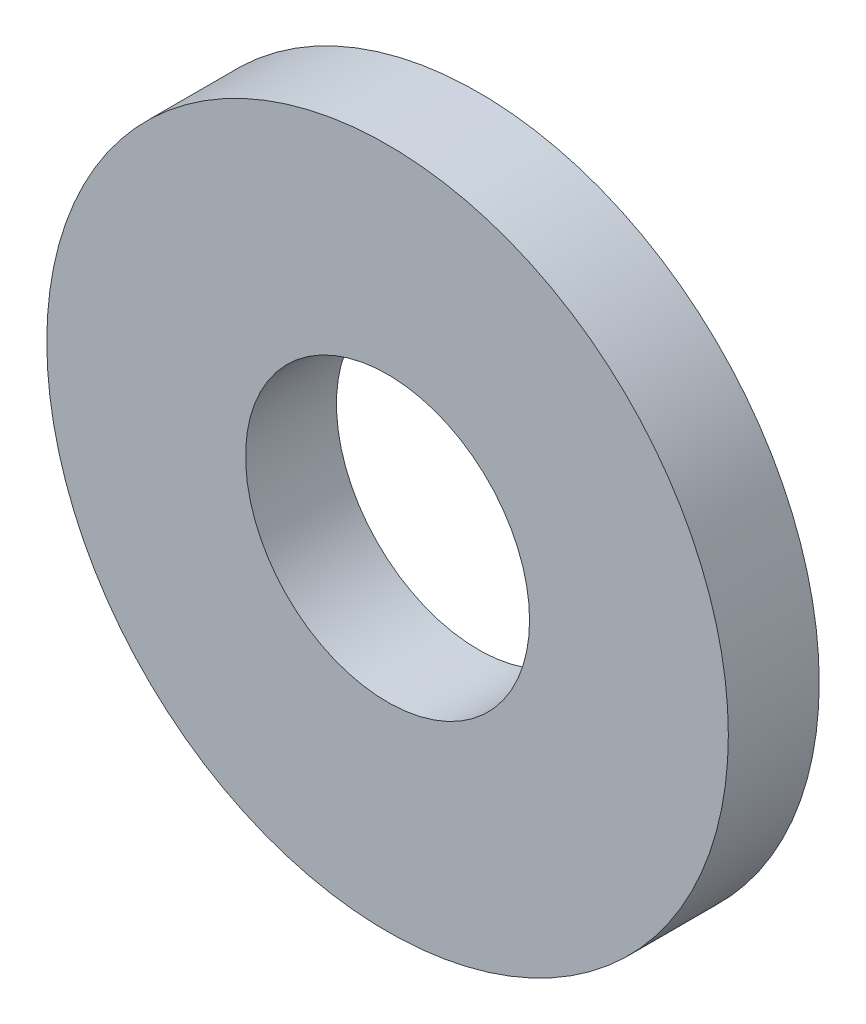
ISO-10303-21;
HEADER;
FILE_DESCRIPTION(('STEP AP214'),'2;1');
FILE_NAME('part.step','',(''),(''),'','','');
FILE_SCHEMA(('AUTOMOTIVE_DESIGN { 1 0 10303 214 1 1 1 1 }'));
ENDSEC;
DATA;
#1=APPLICATION_CONTEXT('core data for automotive mechanical design processes');
#2=APPLICATION_PROTOCOL_DEFINITION('international standard','automotive_design',2000,#1);
#3=PRODUCT_CONTEXT('',#1,'mechanical');
#4=PRODUCT('Part','Part','',(#3));
#5=PRODUCT_RELATED_PRODUCT_CATEGORY('part','',(#4));
#6=PRODUCT_DEFINITION_FORMATION('','',#4);
#7=PRODUCT_DEFINITION_CONTEXT('part definition',#1,'design');
#8=PRODUCT_DEFINITION('design','',#6,#7);
#9=PRODUCT_DEFINITION_SHAPE('','',#8);
#10=(LENGTH_UNIT() NAMED_UNIT(*) SI_UNIT(.MILLI.,.METRE.));
#11=(NAMED_UNIT(*) PLANE_ANGLE_UNIT() SI_UNIT($,.RADIAN.));
#12=(NAMED_UNIT(*) SI_UNIT($,.STERADIAN.) SOLID_ANGLE_UNIT());
#13=UNCERTAINTY_MEASURE_WITH_UNIT(LENGTH_MEASURE(1.E-05),#10,'distance_accuracy_value','');
#14=(GEOMETRIC_REPRESENTATION_CONTEXT(3) GLOBAL_UNCERTAINTY_ASSIGNED_CONTEXT((#13)) GLOBAL_UNIT_ASSIGNED_CONTEXT((#10,
#11,#12)) REPRESENTATION_CONTEXT('',''));
#15=CARTESIAN_POINT('',(0.,0.,0.));
#16=DIRECTION('',(0.,0.,1.));
#17=DIRECTION('',(1.,0.,0.));
#18=AXIS2_PLACEMENT_3D('',#15,#16,#17);
#19=CARTESIAN_POINT('',(0.,0.,1.27));
#20=DIRECTION('',(0.,0.,1.));
#21=DIRECTION('',(1.,0.,0.));
#22=AXIS2_PLACEMENT_3D('',#19,#20,#21);
#23=PLANE('',#22);
#24=CARTESIAN_POINT('',(0.,0.,1.27));
#25=DIRECTION('',(0.,0.,1.));
#26=DIRECTION('',(1.,0.,0.));
#27=AXIS2_PLACEMENT_3D('',#24,#25,#26);
#28=CIRCLE('',#27,4.7625);
#29=CARTESIAN_POINT('',(4.7625,0.,1.27));
#30=VERTEX_POINT('',#29);
#31=EDGE_CURVE('E10',#30,#30,#28,.T.);
#32=ORIENTED_EDGE('',*,*,#31,.T.);
#33=EDGE_LOOP('',(#32));
#34=FACE_BOUND('',#33,.T.);
#35=CARTESIAN_POINT('',(0.,0.,1.27));
#36=DIRECTION('',(0.,0.,1.));
#37=DIRECTION('',(1.,0.,0.));
#38=AXIS2_PLACEMENT_3D('',#35,#36,#37);
#39=CIRCLE('',#38,1.984375);
#40=CARTESIAN_POINT('',(1.984375,0.,1.27));
#41=VERTEX_POINT('',#40);
#42=EDGE_CURVE('E41',#41,#41,#39,.T.);
#43=ORIENTED_EDGE('',*,*,#42,.F.);
#44=EDGE_LOOP('',(#43));
#45=FACE_BOUND('',#44,.T.);
#46=ADVANCED_FACE('F30',(#34,#45),#23,.T.);
#47=CARTESIAN_POINT('',(0.,0.,0.));
#48=DIRECTION('',(0.,0.,1.));
#49=DIRECTION('',(1.,0.,0.));
#50=AXIS2_PLACEMENT_3D('',#47,#48,#49);
#51=PLANE('',#50);
#52=CARTESIAN_POINT('',(0.,0.,0.));
#53=DIRECTION('',(0.,0.,1.));
#54=DIRECTION('',(1.,0.,0.));
#55=AXIS2_PLACEMENT_3D('',#52,#53,#54);
#56=CIRCLE('',#55,4.7625);
#57=CARTESIAN_POINT('',(4.7625,0.,0.));
#58=VERTEX_POINT('',#57);
#59=EDGE_CURVE('E34',#58,#58,#56,.T.);
#60=ORIENTED_EDGE('',*,*,#59,.F.);
#61=EDGE_LOOP('',(#60));
#62=FACE_BOUND('',#61,.T.);
#63=CARTESIAN_POINT('',(0.,0.,0.));
#64=DIRECTION('',(0.,0.,1.));
#65=DIRECTION('',(1.,0.,0.));
#66=AXIS2_PLACEMENT_3D('',#63,#64,#65);
#67=CIRCLE('',#66,1.984375);
#68=CARTESIAN_POINT('',(1.984375,0.,0.));
#69=VERTEX_POINT('',#68);
#70=EDGE_CURVE('E43',#69,#69,#67,.T.);
#71=ORIENTED_EDGE('',*,*,#70,.T.);
#72=EDGE_LOOP('',(#71));
#73=FACE_BOUND('',#72,.T.);
#74=ADVANCED_FACE('F53',(#62,#73),#51,.F.);
#75=CARTESIAN_POINT('',(0.,0.,1.27));
#76=DIRECTION('',(0.,0.,-1.));
#77=DIRECTION('',(-1.,0.,0.));
#78=AXIS2_PLACEMENT_3D('',#75,#76,#77);
#79=CYLINDRICAL_SURFACE('',#78,4.7625);
#80=ORIENTED_EDGE('',*,*,#31,.F.);
#81=EDGE_LOOP('',(#80));
#82=FACE_BOUND('',#81,.T.);
#83=ORIENTED_EDGE('',*,*,#59,.T.);
#84=EDGE_LOOP('',(#83));
#85=FACE_BOUND('',#84,.T.);
#86=ADVANCED_FACE('F32',(#82,#85),#79,.T.);
#87=CARTESIAN_POINT('',(0.,0.,1.27));
#88=DIRECTION('',(0.,0.,-1.));
#89=DIRECTION('',(-1.,0.,0.));
#90=AXIS2_PLACEMENT_3D('',#87,#88,#89);
#91=CYLINDRICAL_SURFACE('',#90,1.984375);
#92=ORIENTED_EDGE('',*,*,#42,.T.);
#93=EDGE_LOOP('',(#92));
#94=FACE_BOUND('',#93,.T.);
#95=ORIENTED_EDGE('',*,*,#70,.F.);
#96=EDGE_LOOP('',(#95));
#97=FACE_BOUND('',#96,.T.);
#98=ADVANCED_FACE('F49',(#94,#97),#91,.F.);
#99=CLOSED_SHELL('',(#46,#74,#86,#98));
#100=MANIFOLD_SOLID_BREP('B2',#99);
#101=ADVANCED_BREP_SHAPE_REPRESENTATION('',(#18,#100),#14);
#102=SHAPE_DEFINITION_REPRESENTATION(#9,#101);
ENDSEC;
END-ISO-10303-21;
